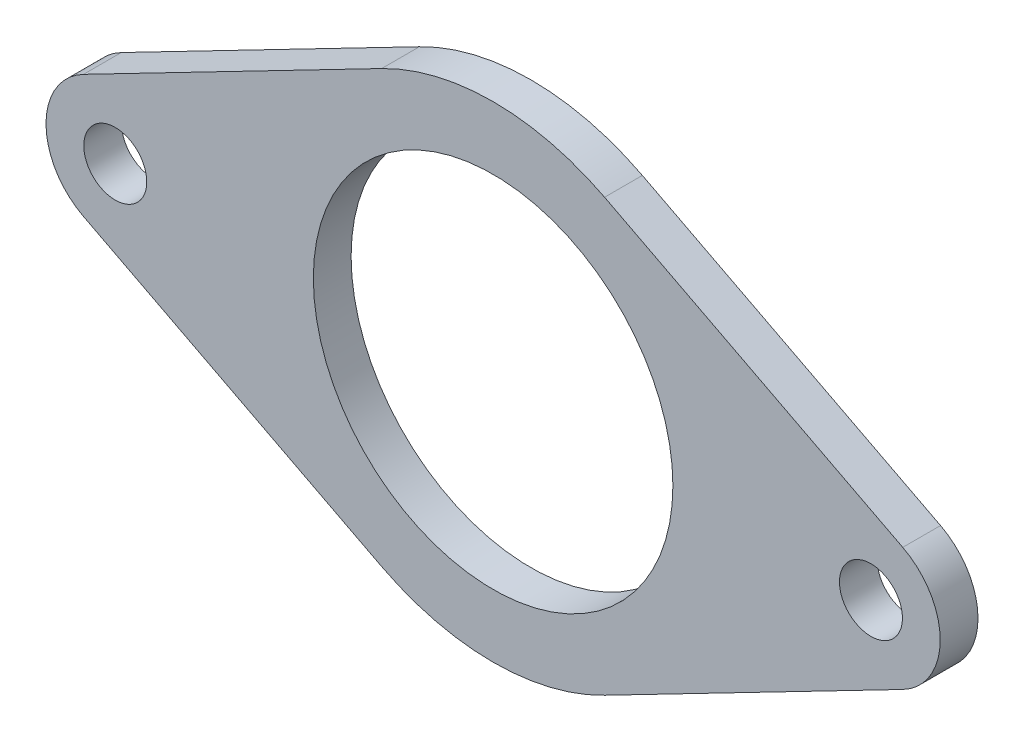
ISO-10303-21;
HEADER;
FILE_DESCRIPTION(('STEP AP214'),'2;1');
FILE_NAME('part.step','',(''),(''),'','','');
FILE_SCHEMA(('AUTOMOTIVE_DESIGN { 1 0 10303 214 1 1 1 1 }'));
ENDSEC;
DATA;
#1=APPLICATION_CONTEXT('core data for automotive mechanical design processes');
#2=APPLICATION_PROTOCOL_DEFINITION('international standard','automotive_design',2000,#1);
#3=PRODUCT_CONTEXT('',#1,'mechanical');
#4=PRODUCT('Part','Part','',(#3));
#5=PRODUCT_RELATED_PRODUCT_CATEGORY('part','',(#4));
#6=PRODUCT_DEFINITION_FORMATION('','',#4);
#7=PRODUCT_DEFINITION_CONTEXT('part definition',#1,'design');
#8=PRODUCT_DEFINITION('design','',#6,#7);
#9=PRODUCT_DEFINITION_SHAPE('','',#8);
#10=(LENGTH_UNIT() NAMED_UNIT(*) SI_UNIT(.MILLI.,.METRE.));
#11=(NAMED_UNIT(*) PLANE_ANGLE_UNIT() SI_UNIT($,.RADIAN.));
#12=(NAMED_UNIT(*) SI_UNIT($,.STERADIAN.) SOLID_ANGLE_UNIT());
#13=UNCERTAINTY_MEASURE_WITH_UNIT(LENGTH_MEASURE(1.E-05),#10,'distance_accuracy_value','');
#14=(GEOMETRIC_REPRESENTATION_CONTEXT(3) GLOBAL_UNCERTAINTY_ASSIGNED_CONTEXT((#13)) GLOBAL_UNIT_ASSIGNED_CONTEXT((#10,
#11,#12)) REPRESENTATION_CONTEXT('',''));
#15=CARTESIAN_POINT('',(0.,0.,0.));
#16=DIRECTION('',(0.,0.,1.));
#17=DIRECTION('',(1.,0.,0.));
#18=AXIS2_PLACEMENT_3D('',#15,#16,#17);
#19=CARTESIAN_POINT('',(0.,0.,3.));
#20=DIRECTION('',(0.,0.,-1.));
#21=DIRECTION('',(-1.,0.,0.));
#22=AXIS2_PLACEMENT_3D('',#19,#20,#21);
#23=CYLINDRICAL_SURFACE('',#22,19.2748);
#24=CARTESIAN_POINT('',(0.,0.,0.));
#25=DIRECTION('',(0.,0.,1.));
#26=DIRECTION('',(1.,0.,0.));
#27=AXIS2_PLACEMENT_3D('',#24,#25,#26);
#28=CIRCLE('',#27,19.2748);
#29=CARTESIAN_POINT('',(8.85021716800001,-17.1228377063861,0.));
#30=VERTEX_POINT('',#29);
#31=CARTESIAN_POINT('',(-8.85021716800001,-17.1228377063861,0.));
#32=VERTEX_POINT('',#31);
#33=EDGE_CURVE('E139',#30,#32,#28,.F.);
#34=ORIENTED_EDGE('',*,*,#33,.F.);
#35=DIRECTION('',(0.,0.,-1.));
#36=VECTOR('',#35,1.);
#37=CARTESIAN_POINT('',(8.85021716800001,-17.1228377063861,3.));
#38=LINE('',#37,#36);
#39=CARTESIAN_POINT('',(8.85021716800001,-17.1228377063861,3.));
#40=VERTEX_POINT('',#39);
#41=EDGE_CURVE('E11',#40,#30,#38,.T.);
#42=ORIENTED_EDGE('',*,*,#41,.F.);
#43=CARTESIAN_POINT('',(0.,0.,3.));
#44=DIRECTION('',(0.,0.,1.));
#45=DIRECTION('',(1.,0.,0.));
#46=AXIS2_PLACEMENT_3D('',#43,#44,#45);
#47=CIRCLE('',#46,19.2748);
#48=CARTESIAN_POINT('',(-8.85021716800001,-17.1228377063861,3.));
#49=VERTEX_POINT('',#48);
#50=EDGE_CURVE('E166',#40,#49,#47,.F.);
#51=ORIENTED_EDGE('',*,*,#50,.T.);
#52=DIRECTION('',(0.,0.,-1.));
#53=VECTOR('',#52,1.);
#54=CARTESIAN_POINT('',(-8.85021716800001,-17.1228377063861,3.));
#55=LINE('',#54,#53);
#56=EDGE_CURVE('E50',#49,#32,#55,.T.);
#57=ORIENTED_EDGE('',*,*,#56,.T.);
#58=EDGE_LOOP('',(#34,#42,#51,#57));
#59=FACE_BOUND('',#58,.T.);
#60=ADVANCED_FACE('F34',(#59),#23,.T.);
#61=CARTESIAN_POINT('',(8.85021716800002,-17.1228377063861,3.));
#62=DIRECTION('',(-0.459160000000001,0.888353586360746,0.));
#63=DIRECTION('',(-0.888353586360746,-0.459160000000001,0.));
#64=AXIS2_PLACEMENT_3D('',#61,#62,#63);
#65=PLANE('',#64);
#66=DIRECTION('',(0.888353586360746,0.459160000000001,0.));
#67=VECTOR('',#66,1.);
#68=CARTESIAN_POINT('',(8.85021716800002,-17.1228377063861,0.));
#69=LINE('',#68,#67);
#70=CARTESIAN_POINT('',(32.52538,-4.88594472498408,0.));
#71=VERTEX_POINT('',#70);
#72=EDGE_CURVE('E141',#30,#71,#69,.T.);
#73=ORIENTED_EDGE('',*,*,#72,.T.);
#74=DIRECTION('',(0.,0.,-1.));
#75=VECTOR('',#74,1.);
#76=CARTESIAN_POINT('',(32.52538,-4.88594472498408,3.));
#77=LINE('',#76,#75);
#78=CARTESIAN_POINT('',(32.52538,-4.88594472498408,3.));
#79=VERTEX_POINT('',#78);
#80=EDGE_CURVE('E42',#79,#71,#77,.T.);
#81=ORIENTED_EDGE('',*,*,#80,.F.);
#82=DIRECTION('',(0.888353586360746,0.459160000000001,0.));
#83=VECTOR('',#82,1.);
#84=CARTESIAN_POINT('',(8.85021716800002,-17.1228377063861,3.));
#85=LINE('',#84,#83);
#86=EDGE_CURVE('E193',#40,#79,#85,.T.);
#87=ORIENTED_EDGE('',*,*,#86,.F.);
#88=ORIENTED_EDGE('',*,*,#41,.T.);
#89=EDGE_LOOP('',(#73,#81,#87,#88));
#90=FACE_BOUND('',#89,.T.);
#91=ADVANCED_FACE('F213',(#90),#65,.F.);
#92=CARTESIAN_POINT('',(30.,0.,3.));
#93=DIRECTION('',(0.,0.,-1.));
#94=DIRECTION('',(-1.,0.,0.));
#95=AXIS2_PLACEMENT_3D('',#92,#93,#94);
#96=CYLINDRICAL_SURFACE('',#95,5.5);
#97=CARTESIAN_POINT('',(30.,0.,0.));
#98=DIRECTION('',(0.,0.,1.));
#99=DIRECTION('',(1.,0.,0.));
#100=AXIS2_PLACEMENT_3D('',#97,#98,#99);
#101=CIRCLE('',#100,5.5);
#102=CARTESIAN_POINT('',(32.52538,4.8859447249841,0.));
#103=VERTEX_POINT('',#102);
#104=EDGE_CURVE('E143',#71,#103,#101,.T.);
#105=ORIENTED_EDGE('',*,*,#104,.T.);
#106=DIRECTION('',(0.,0.,-1.));
#107=VECTOR('',#106,1.);
#108=CARTESIAN_POINT('',(32.52538,4.8859447249841,3.));
#109=LINE('',#108,#107);
#110=CARTESIAN_POINT('',(32.52538,4.8859447249841,3.));
#111=VERTEX_POINT('',#110);
#112=EDGE_CURVE('E172',#111,#103,#109,.T.);
#113=ORIENTED_EDGE('',*,*,#112,.F.);
#114=CARTESIAN_POINT('',(30.,0.,3.));
#115=DIRECTION('',(0.,0.,1.));
#116=DIRECTION('',(1.,0.,0.));
#117=AXIS2_PLACEMENT_3D('',#114,#115,#116);
#118=CIRCLE('',#117,5.5);
#119=EDGE_CURVE('E180',#79,#111,#118,.T.);
#120=ORIENTED_EDGE('',*,*,#119,.F.);
#121=ORIENTED_EDGE('',*,*,#80,.T.);
#122=EDGE_LOOP('',(#105,#113,#120,#121));
#123=FACE_BOUND('',#122,.T.);
#124=ADVANCED_FACE('F178',(#123),#96,.T.);
#125=CARTESIAN_POINT('',(8.85021716800002,17.1228377063861,3.));
#126=DIRECTION('',(0.459160000000001,0.888353586360746,0.));
#127=DIRECTION('',(-0.888353586360746,0.459160000000001,0.));
#128=AXIS2_PLACEMENT_3D('',#125,#126,#127);
#129=PLANE('',#128);
#130=DIRECTION('',(0.888353586360746,-0.459160000000001,0.));
#131=VECTOR('',#130,1.);
#132=CARTESIAN_POINT('',(8.85021716800002,17.1228377063861,0.));
#133=LINE('',#132,#131);
#134=CARTESIAN_POINT('',(8.85021716800001,17.1228377063861,0.));
#135=VERTEX_POINT('',#134);
#136=EDGE_CURVE('E146',#135,#103,#133,.T.);
#137=ORIENTED_EDGE('',*,*,#136,.F.);
#138=DIRECTION('',(0.,0.,-1.));
#139=VECTOR('',#138,1.);
#140=CARTESIAN_POINT('',(8.85021716800001,17.1228377063861,3.));
#141=LINE('',#140,#139);
#142=CARTESIAN_POINT('',(8.85021716800001,17.1228377063861,3.));
#143=VERTEX_POINT('',#142);
#144=EDGE_CURVE('E170',#143,#135,#141,.T.);
#145=ORIENTED_EDGE('',*,*,#144,.F.);
#146=DIRECTION('',(0.888353586360746,-0.459160000000001,0.));
#147=VECTOR('',#146,1.);
#148=CARTESIAN_POINT('',(8.85021716800002,17.1228377063861,3.));
#149=LINE('',#148,#147);
#150=EDGE_CURVE('E191',#143,#111,#149,.T.);
#151=ORIENTED_EDGE('',*,*,#150,.T.);
#152=ORIENTED_EDGE('',*,*,#112,.T.);
#153=EDGE_LOOP('',(#137,#145,#151,#152));
#154=FACE_BOUND('',#153,.T.);
#155=ADVANCED_FACE('F189',(#154),#129,.T.);
#156=CARTESIAN_POINT('',(0.,0.,3.));
#157=DIRECTION('',(0.,0.,-1.));
#158=DIRECTION('',(-1.,0.,0.));
#159=AXIS2_PLACEMENT_3D('',#156,#157,#158);
#160=CYLINDRICAL_SURFACE('',#159,19.2748);
#161=CARTESIAN_POINT('',(0.,0.,0.));
#162=DIRECTION('',(0.,0.,1.));
#163=DIRECTION('',(1.,0.,0.));
#164=AXIS2_PLACEMENT_3D('',#161,#162,#163);
#165=CIRCLE('',#164,19.2748);
#166=CARTESIAN_POINT('',(-8.85021716800001,17.1228377063861,0.));
#167=VERTEX_POINT('',#166);
#168=EDGE_CURVE('E149',#135,#167,#165,.T.);
#169=ORIENTED_EDGE('',*,*,#168,.T.);
#170=DIRECTION('',(0.,0.,-1.));
#171=VECTOR('',#170,1.);
#172=CARTESIAN_POINT('',(-8.85021716800001,17.1228377063861,3.));
#173=LINE('',#172,#171);
#174=CARTESIAN_POINT('',(-8.85021716800001,17.1228377063861,3.));
#175=VERTEX_POINT('',#174);
#176=EDGE_CURVE('E122',#175,#167,#173,.T.);
#177=ORIENTED_EDGE('',*,*,#176,.F.);
#178=CARTESIAN_POINT('',(0.,0.,3.));
#179=DIRECTION('',(0.,0.,1.));
#180=DIRECTION('',(1.,0.,0.));
#181=AXIS2_PLACEMENT_3D('',#178,#179,#180);
#182=CIRCLE('',#181,19.2748);
#183=EDGE_CURVE('E110',#143,#175,#182,.T.);
#184=ORIENTED_EDGE('',*,*,#183,.F.);
#185=ORIENTED_EDGE('',*,*,#144,.T.);
#186=EDGE_LOOP('',(#169,#177,#184,#185));
#187=FACE_BOUND('',#186,.T.);
#188=ADVANCED_FACE('F224',(#187),#160,.T.);
#189=CARTESIAN_POINT('',(-8.85021716800001,17.1228377063861,3.));
#190=DIRECTION('',(0.45916,-0.888353586360746,0.));
#191=DIRECTION('',(0.888353586360746,0.45916,0.));
#192=AXIS2_PLACEMENT_3D('',#189,#190,#191);
#193=PLANE('',#192);
#194=DIRECTION('',(-0.888353586360746,-0.45916,0.));
#195=VECTOR('',#194,1.);
#196=CARTESIAN_POINT('',(-8.85021716800001,17.1228377063861,0.));
#197=LINE('',#196,#195);
#198=CARTESIAN_POINT('',(-32.52538,4.8859447249841,0.));
#199=VERTEX_POINT('',#198);
#200=EDGE_CURVE('E119',#167,#199,#197,.T.);
#201=ORIENTED_EDGE('',*,*,#200,.T.);
#202=DIRECTION('',(0.,0.,-1.));
#203=VECTOR('',#202,1.);
#204=CARTESIAN_POINT('',(-32.52538,4.8859447249841,3.));
#205=LINE('',#204,#203);
#206=CARTESIAN_POINT('',(-32.52538,4.8859447249841,3.));
#207=VERTEX_POINT('',#206);
#208=EDGE_CURVE('E116',#207,#199,#205,.T.);
#209=ORIENTED_EDGE('',*,*,#208,.F.);
#210=DIRECTION('',(-0.888353586360746,-0.45916,0.));
#211=VECTOR('',#210,1.);
#212=CARTESIAN_POINT('',(-8.85021716800001,17.1228377063861,3.));
#213=LINE('',#212,#211);
#214=EDGE_CURVE('E100',#175,#207,#213,.T.);
#215=ORIENTED_EDGE('',*,*,#214,.F.);
#216=ORIENTED_EDGE('',*,*,#176,.T.);
#217=EDGE_LOOP('',(#201,#209,#215,#216));
#218=FACE_BOUND('',#217,.T.);
#219=ADVANCED_FACE('F117',(#218),#193,.F.);
#220=CARTESIAN_POINT('',(-30.,0.,3.));
#221=DIRECTION('',(0.,0.,-1.));
#222=DIRECTION('',(-1.,0.,0.));
#223=AXIS2_PLACEMENT_3D('',#220,#221,#222);
#224=CYLINDRICAL_SURFACE('',#223,5.5);
#225=CARTESIAN_POINT('',(-30.,0.,0.));
#226=DIRECTION('',(0.,0.,1.));
#227=DIRECTION('',(1.,0.,0.));
#228=AXIS2_PLACEMENT_3D('',#225,#226,#227);
#229=CIRCLE('',#228,5.5);
#230=CARTESIAN_POINT('',(-32.52538,-4.8859447249841,0.));
#231=VERTEX_POINT('',#230);
#232=EDGE_CURVE('E152',#199,#231,#229,.T.);
#233=ORIENTED_EDGE('',*,*,#232,.T.);
#234=DIRECTION('',(0.,0.,-1.));
#235=VECTOR('',#234,1.);
#236=CARTESIAN_POINT('',(-32.52538,-4.8859447249841,3.));
#237=LINE('',#236,#235);
#238=CARTESIAN_POINT('',(-32.52538,-4.8859447249841,3.));
#239=VERTEX_POINT('',#238);
#240=EDGE_CURVE('E76',#239,#231,#237,.T.);
#241=ORIENTED_EDGE('',*,*,#240,.F.);
#242=CARTESIAN_POINT('',(-30.,0.,3.));
#243=DIRECTION('',(0.,0.,1.));
#244=DIRECTION('',(1.,0.,0.));
#245=AXIS2_PLACEMENT_3D('',#242,#243,#244);
#246=CIRCLE('',#245,5.5);
#247=EDGE_CURVE('E107',#207,#239,#246,.T.);
#248=ORIENTED_EDGE('',*,*,#247,.F.);
#249=ORIENTED_EDGE('',*,*,#208,.T.);
#250=EDGE_LOOP('',(#233,#241,#248,#249));
#251=FACE_BOUND('',#250,.T.);
#252=ADVANCED_FACE('F124',(#251),#224,.T.);
#253=CARTESIAN_POINT('',(-30.,0.,3.));
#254=DIRECTION('',(0.,0.,-1.));
#255=DIRECTION('',(-1.,0.,0.));
#256=AXIS2_PLACEMENT_3D('',#253,#254,#255);
#257=CYLINDRICAL_SURFACE('',#256,2.5);
#258=CARTESIAN_POINT('',(-30.,0.,3.));
#259=DIRECTION('',(0.,0.,1.));
#260=DIRECTION('',(1.,0.,0.));
#261=AXIS2_PLACEMENT_3D('',#258,#259,#260);
#262=CIRCLE('',#261,2.5);
#263=CARTESIAN_POINT('',(-27.5,0.,3.));
#264=VERTEX_POINT('',#263);
#265=EDGE_CURVE('E133',#264,#264,#262,.T.);
#266=ORIENTED_EDGE('',*,*,#265,.T.);
#267=EDGE_LOOP('',(#266));
#268=FACE_BOUND('',#267,.T.);
#269=CARTESIAN_POINT('',(-30.,0.,0.));
#270=DIRECTION('',(0.,0.,1.));
#271=DIRECTION('',(1.,0.,0.));
#272=AXIS2_PLACEMENT_3D('',#269,#270,#271);
#273=CIRCLE('',#272,2.5);
#274=CARTESIAN_POINT('',(-27.5,0.,0.));
#275=VERTEX_POINT('',#274);
#276=EDGE_CURVE('E160',#275,#275,#273,.T.);
#277=ORIENTED_EDGE('',*,*,#276,.F.);
#278=EDGE_LOOP('',(#277));
#279=FACE_BOUND('',#278,.T.);
#280=ADVANCED_FACE('F208',(#268,#279),#257,.F.);
#281=CARTESIAN_POINT('',(0.,0.,3.));
#282=DIRECTION('',(0.,0.,-1.));
#283=DIRECTION('',(-1.,0.,0.));
#284=AXIS2_PLACEMENT_3D('',#281,#282,#283);
#285=CYLINDRICAL_SURFACE('',#284,14.2748);
#286=CARTESIAN_POINT('',(0.,0.,3.));
#287=DIRECTION('',(0.,0.,1.));
#288=DIRECTION('',(1.,0.,0.));
#289=AXIS2_PLACEMENT_3D('',#286,#287,#288);
#290=CIRCLE('',#289,14.2748);
#291=CARTESIAN_POINT('',(14.2748,0.,3.));
#292=VERTEX_POINT('',#291);
#293=EDGE_CURVE('E127',#292,#292,#290,.T.);
#294=ORIENTED_EDGE('',*,*,#293,.T.);
#295=EDGE_LOOP('',(#294));
#296=FACE_BOUND('',#295,.T.);
#297=CARTESIAN_POINT('',(0.,0.,0.));
#298=DIRECTION('',(0.,0.,1.));
#299=DIRECTION('',(1.,0.,0.));
#300=AXIS2_PLACEMENT_3D('',#297,#298,#299);
#301=CIRCLE('',#300,14.2748);
#302=CARTESIAN_POINT('',(14.2748,0.,0.));
#303=VERTEX_POINT('',#302);
#304=EDGE_CURVE('E157',#303,#303,#301,.T.);
#305=ORIENTED_EDGE('',*,*,#304,.F.);
#306=EDGE_LOOP('',(#305));
#307=FACE_BOUND('',#306,.T.);
#308=ADVANCED_FACE('F200',(#296,#307),#285,.F.);
#309=CARTESIAN_POINT('',(-8.85021716800001,-17.1228377063861,3.));
#310=DIRECTION('',(-0.45916,-0.888353586360746,0.));
#311=DIRECTION('',(0.888353586360746,-0.45916,0.));
#312=AXIS2_PLACEMENT_3D('',#309,#310,#311);
#313=PLANE('',#312);
#314=DIRECTION('',(-0.888353586360746,0.45916,0.));
#315=VECTOR('',#314,1.);
#316=CARTESIAN_POINT('',(-8.85021716800001,-17.1228377063861,0.));
#317=LINE('',#316,#315);
#318=EDGE_CURVE('E154',#32,#231,#317,.T.);
#319=ORIENTED_EDGE('',*,*,#318,.F.);
#320=ORIENTED_EDGE('',*,*,#56,.F.);
#321=DIRECTION('',(-0.888353586360746,0.45916,0.));
#322=VECTOR('',#321,1.);
#323=CARTESIAN_POINT('',(-8.85021716800001,-17.1228377063861,3.));
#324=LINE('',#323,#322);
#325=EDGE_CURVE('E125',#49,#239,#324,.T.);
#326=ORIENTED_EDGE('',*,*,#325,.T.);
#327=ORIENTED_EDGE('',*,*,#240,.T.);
#328=EDGE_LOOP('',(#319,#320,#326,#327));
#329=FACE_BOUND('',#328,.T.);
#330=ADVANCED_FACE('F197',(#329),#313,.T.);
#331=CARTESIAN_POINT('',(30.,0.,3.));
#332=DIRECTION('',(0.,0.,-1.));
#333=DIRECTION('',(-1.,0.,0.));
#334=AXIS2_PLACEMENT_3D('',#331,#332,#333);
#335=CYLINDRICAL_SURFACE('',#334,2.5);
#336=CARTESIAN_POINT('',(30.,0.,3.));
#337=DIRECTION('',(0.,0.,1.));
#338=DIRECTION('',(1.,0.,0.));
#339=AXIS2_PLACEMENT_3D('',#336,#337,#338);
#340=CIRCLE('',#339,2.5);
#341=CARTESIAN_POINT('',(32.5,0.,3.));
#342=VERTEX_POINT('',#341);
#343=EDGE_CURVE('E136',#342,#342,#340,.T.);
#344=ORIENTED_EDGE('',*,*,#343,.T.);
#345=EDGE_LOOP('',(#344));
#346=FACE_BOUND('',#345,.T.);
#347=CARTESIAN_POINT('',(30.,0.,0.));
#348=DIRECTION('',(0.,0.,1.));
#349=DIRECTION('',(1.,0.,0.));
#350=AXIS2_PLACEMENT_3D('',#347,#348,#349);
#351=CIRCLE('',#350,2.5);
#352=CARTESIAN_POINT('',(32.5,0.,0.));
#353=VERTEX_POINT('',#352);
#354=EDGE_CURVE('E163',#353,#353,#351,.T.);
#355=ORIENTED_EDGE('',*,*,#354,.F.);
#356=EDGE_LOOP('',(#355));
#357=FACE_BOUND('',#356,.T.);
#358=ADVANCED_FACE('F199',(#346,#357),#335,.F.);
#359=CARTESIAN_POINT('',(0.,0.,3.));
#360=DIRECTION('',(0.,0.,1.));
#361=DIRECTION('',(1.,0.,0.));
#362=AXIS2_PLACEMENT_3D('',#359,#360,#361);
#363=PLANE('',#362);
#364=ORIENTED_EDGE('',*,*,#50,.F.);
#365=ORIENTED_EDGE('',*,*,#86,.T.);
#366=ORIENTED_EDGE('',*,*,#119,.T.);
#367=ORIENTED_EDGE('',*,*,#150,.F.);
#368=ORIENTED_EDGE('',*,*,#183,.T.);
#369=ORIENTED_EDGE('',*,*,#214,.T.);
#370=ORIENTED_EDGE('',*,*,#247,.T.);
#371=ORIENTED_EDGE('',*,*,#325,.F.);
#372=EDGE_LOOP('',(#364,#365,#366,#367,#368,#369,#370,#371));
#373=FACE_BOUND('',#372,.T.);
#374=ORIENTED_EDGE('',*,*,#293,.F.);
#375=EDGE_LOOP('',(#374));
#376=FACE_BOUND('',#375,.T.);
#377=ORIENTED_EDGE('',*,*,#265,.F.);
#378=EDGE_LOOP('',(#377));
#379=FACE_BOUND('',#378,.T.);
#380=ORIENTED_EDGE('',*,*,#343,.F.);
#381=EDGE_LOOP('',(#380));
#382=FACE_BOUND('',#381,.T.);
#383=ADVANCED_FACE('F103',(#373,#376,#379,#382),#363,.T.);
#384=CARTESIAN_POINT('',(0.,0.,0.));
#385=DIRECTION('',(0.,0.,1.));
#386=DIRECTION('',(1.,0.,0.));
#387=AXIS2_PLACEMENT_3D('',#384,#385,#386);
#388=PLANE('',#387);
#389=ORIENTED_EDGE('',*,*,#33,.T.);
#390=ORIENTED_EDGE('',*,*,#318,.T.);
#391=ORIENTED_EDGE('',*,*,#232,.F.);
#392=ORIENTED_EDGE('',*,*,#200,.F.);
#393=ORIENTED_EDGE('',*,*,#168,.F.);
#394=ORIENTED_EDGE('',*,*,#136,.T.);
#395=ORIENTED_EDGE('',*,*,#104,.F.);
#396=ORIENTED_EDGE('',*,*,#72,.F.);
#397=EDGE_LOOP('',(#389,#390,#391,#392,#393,#394,#395,#396));
#398=FACE_BOUND('',#397,.T.);
#399=ORIENTED_EDGE('',*,*,#304,.T.);
#400=EDGE_LOOP('',(#399));
#401=FACE_BOUND('',#400,.T.);
#402=ORIENTED_EDGE('',*,*,#276,.T.);
#403=EDGE_LOOP('',(#402));
#404=FACE_BOUND('',#403,.T.);
#405=ORIENTED_EDGE('',*,*,#354,.T.);
#406=EDGE_LOOP('',(#405));
#407=FACE_BOUND('',#406,.T.);
#408=ADVANCED_FACE('F184',(#398,#401,#404,#407),#388,.F.);
#409=CLOSED_SHELL('',(#60,#91,#124,#155,#188,#219,#252,#280,#308,#330,#358,#383,#408));
#410=MANIFOLD_SOLID_BREP('B2',#409);
#411=ADVANCED_BREP_SHAPE_REPRESENTATION('',(#18,#410),#14);
#412=SHAPE_DEFINITION_REPRESENTATION(#9,#411);
ENDSEC;
END-ISO-10303-21;
